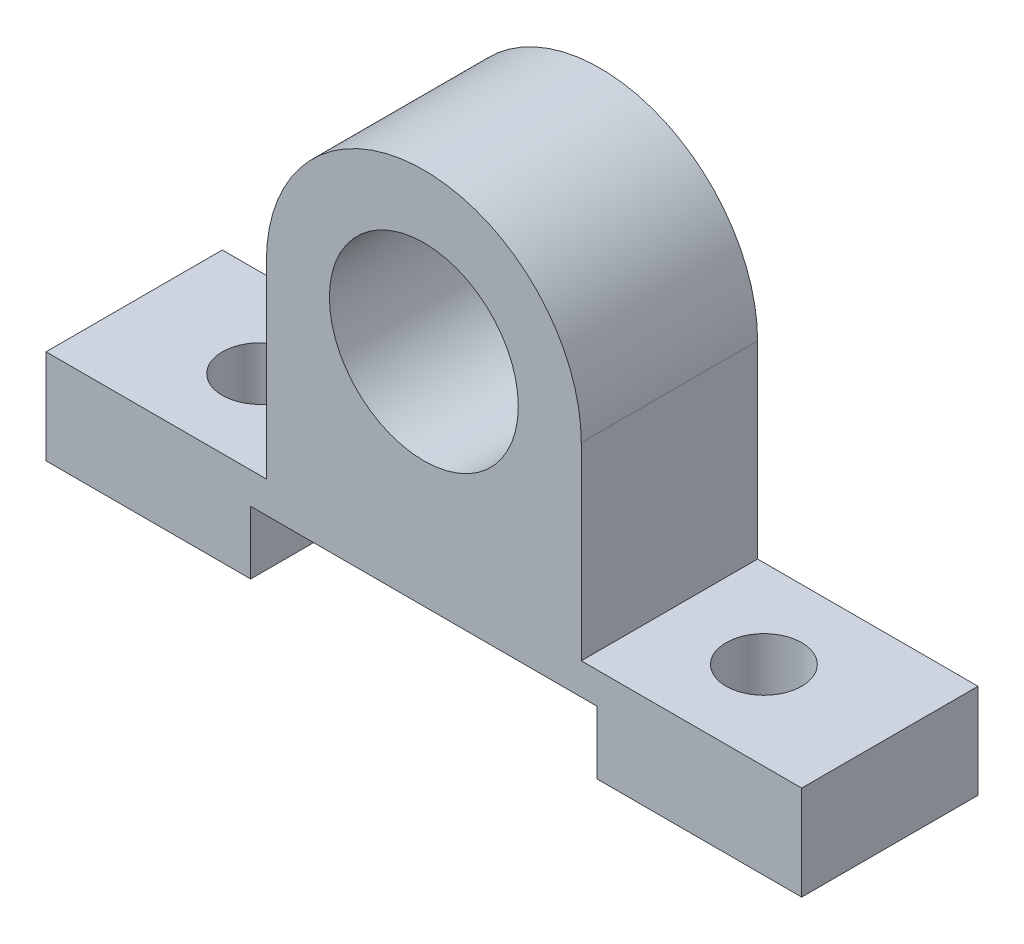
ISO-10303-21;
HEADER;
FILE_DESCRIPTION(('STEP AP214'),'2;1');
FILE_NAME('part.step','',(''),(''),'','','');
FILE_SCHEMA(('AUTOMOTIVE_DESIGN { 1 0 10303 214 1 1 1 1 }'));
ENDSEC;
DATA;
#1=APPLICATION_CONTEXT('core data for automotive mechanical design processes');
#2=APPLICATION_PROTOCOL_DEFINITION('international standard','automotive_design',2000,#1);
#3=PRODUCT_CONTEXT('',#1,'mechanical');
#4=PRODUCT('Part','Part','',(#3));
#5=PRODUCT_RELATED_PRODUCT_CATEGORY('part','',(#4));
#6=PRODUCT_DEFINITION_FORMATION('','',#4);
#7=PRODUCT_DEFINITION_CONTEXT('part definition',#1,'design');
#8=PRODUCT_DEFINITION('design','',#6,#7);
#9=PRODUCT_DEFINITION_SHAPE('','',#8);
#10=(LENGTH_UNIT() NAMED_UNIT(*) SI_UNIT(.MILLI.,.METRE.));
#11=(NAMED_UNIT(*) PLANE_ANGLE_UNIT() SI_UNIT($,.RADIAN.));
#12=(NAMED_UNIT(*) SI_UNIT($,.STERADIAN.) SOLID_ANGLE_UNIT());
#13=UNCERTAINTY_MEASURE_WITH_UNIT(LENGTH_MEASURE(1.E-05),#10,'distance_accuracy_value','');
#14=(GEOMETRIC_REPRESENTATION_CONTEXT(3) GLOBAL_UNCERTAINTY_ASSIGNED_CONTEXT((#13)) GLOBAL_UNIT_ASSIGNED_CONTEXT((#10,
#11,#12)) REPRESENTATION_CONTEXT('',''));
#15=CARTESIAN_POINT('',(0.,0.,0.));
#16=DIRECTION('',(0.,0.,1.));
#17=DIRECTION('',(1.,0.,0.));
#18=AXIS2_PLACEMENT_3D('',#15,#16,#17);
#19=CARTESIAN_POINT('',(0.,57.15,17.78));
#20=DIRECTION('',(0.,0.,1.));
#21=DIRECTION('',(1.,0.,0.));
#22=AXIS2_PLACEMENT_3D('',#19,#20,#21);
#23=PLANE('',#22);
#24=DIRECTION('',(0.,-1.,0.));
#25=VECTOR('',#24,1.);
#26=CARTESIAN_POINT('',(34.925,0.,17.78));
#27=LINE('',#26,#25);
#28=CARTESIAN_POINT('',(34.925,12.7,17.78));
#29=VERTEX_POINT('',#28);
#30=CARTESIAN_POINT('',(34.925,0.,17.78));
#31=VERTEX_POINT('',#30);
#32=EDGE_CURVE('E204',#29,#31,#27,.T.);
#33=ORIENTED_EDGE('',*,*,#32,.T.);
#34=DIRECTION('',(1.,0.,0.));
#35=VECTOR('',#34,1.);
#36=CARTESIAN_POINT('',(34.925,0.,17.78));
#37=LINE('',#36,#35);
#38=CARTESIAN_POINT('',(76.2,0.,17.78));
#39=VERTEX_POINT('',#38);
#40=EDGE_CURVE('E116',#31,#39,#37,.T.);
#41=ORIENTED_EDGE('',*,*,#40,.T.);
#42=DIRECTION('',(0.,1.,0.));
#43=VECTOR('',#42,1.);
#44=CARTESIAN_POINT('',(76.2,0.,17.78));
#45=LINE('',#44,#43);
#46=CARTESIAN_POINT('',(76.2,19.05,17.78));
#47=VERTEX_POINT('',#46);
#48=EDGE_CURVE('E241',#39,#47,#45,.T.);
#49=ORIENTED_EDGE('',*,*,#48,.T.);
#50=DIRECTION('',(-1.,0.,0.));
#51=VECTOR('',#50,1.);
#52=CARTESIAN_POINT('',(76.2,19.05,17.78));
#53=LINE('',#52,#51);
#54=CARTESIAN_POINT('',(31.75,19.05,17.78));
#55=VERTEX_POINT('',#54);
#56=EDGE_CURVE('E261',#47,#55,#53,.T.);
#57=ORIENTED_EDGE('',*,*,#56,.T.);
#58=DIRECTION('',(0.,1.,0.));
#59=VECTOR('',#58,1.);
#60=CARTESIAN_POINT('',(31.75,19.05,17.78));
#61=LINE('',#60,#59);
#62=CARTESIAN_POINT('',(31.75,57.15,17.78));
#63=VERTEX_POINT('',#62);
#64=EDGE_CURVE('E257',#55,#63,#61,.T.);
#65=ORIENTED_EDGE('',*,*,#64,.T.);
#66=CARTESIAN_POINT('',(0.,57.15,17.78));
#67=DIRECTION('',(0.,0.,1.));
#68=DIRECTION('',(1.,0.,0.));
#69=AXIS2_PLACEMENT_3D('',#66,#67,#68);
#70=CIRCLE('',#69,31.75);
#71=CARTESIAN_POINT('',(-31.75,57.15,17.78));
#72=VERTEX_POINT('',#71);
#73=EDGE_CURVE('E260',#63,#72,#70,.T.);
#74=ORIENTED_EDGE('',*,*,#73,.T.);
#75=DIRECTION('',(0.,-1.,0.));
#76=VECTOR('',#75,1.);
#77=CARTESIAN_POINT('',(-31.75,19.05,17.78));
#78=LINE('',#77,#76);
#79=CARTESIAN_POINT('',(-31.75,19.05,17.78));
#80=VERTEX_POINT('',#79);
#81=EDGE_CURVE('E265',#72,#80,#78,.T.);
#82=ORIENTED_EDGE('',*,*,#81,.T.);
#83=DIRECTION('',(-1.,0.,0.));
#84=VECTOR('',#83,1.);
#85=CARTESIAN_POINT('',(-76.2,19.05,17.78));
#86=LINE('',#85,#84);
#87=CARTESIAN_POINT('',(-76.2,19.05,17.78));
#88=VERTEX_POINT('',#87);
#89=EDGE_CURVE('E272',#80,#88,#86,.T.);
#90=ORIENTED_EDGE('',*,*,#89,.T.);
#91=DIRECTION('',(0.,-1.,0.));
#92=VECTOR('',#91,1.);
#93=CARTESIAN_POINT('',(-76.2,0.,17.78));
#94=LINE('',#93,#92);
#95=CARTESIAN_POINT('',(-76.2,0.,17.78));
#96=VERTEX_POINT('',#95);
#97=EDGE_CURVE('E147',#88,#96,#94,.T.);
#98=ORIENTED_EDGE('',*,*,#97,.T.);
#99=DIRECTION('',(1.,0.,0.));
#100=VECTOR('',#99,1.);
#101=CARTESIAN_POINT('',(-34.925,0.,17.78));
#102=LINE('',#101,#100);
#103=CARTESIAN_POINT('',(-34.925,0.,17.78));
#104=VERTEX_POINT('',#103);
#105=EDGE_CURVE('E141',#96,#104,#102,.T.);
#106=ORIENTED_EDGE('',*,*,#105,.T.);
#107=DIRECTION('',(0.,1.,0.));
#108=VECTOR('',#107,1.);
#109=CARTESIAN_POINT('',(-34.925,0.,17.78));
#110=LINE('',#109,#108);
#111=CARTESIAN_POINT('',(-34.925,12.7,17.78));
#112=VERTEX_POINT('',#111);
#113=EDGE_CURVE('E145',#104,#112,#110,.T.);
#114=ORIENTED_EDGE('',*,*,#113,.T.);
#115=DIRECTION('',(1.,0.,0.));
#116=VECTOR('',#115,1.);
#117=CARTESIAN_POINT('',(34.925,12.7,17.78));
#118=LINE('',#117,#116);
#119=EDGE_CURVE('E61',#112,#29,#118,.T.);
#120=ORIENTED_EDGE('',*,*,#119,.T.);
#121=EDGE_LOOP('',(#33,#41,#49,#57,#65,#74,#82,#90,#98,#106,#114,#120));
#122=FACE_BOUND('',#121,.T.);
#123=CARTESIAN_POINT('',(0.,57.15,17.78));
#124=DIRECTION('',(0.,0.,1.));
#125=DIRECTION('',(1.,0.,0.));
#126=AXIS2_PLACEMENT_3D('',#123,#124,#125);
#127=CIRCLE('',#126,19.05);
#128=CARTESIAN_POINT('',(-19.05,57.15,17.78));
#129=VERTEX_POINT('',#128);
#130=EDGE_CURVE('E174',#129,#129,#127,.T.);
#131=ORIENTED_EDGE('',*,*,#130,.F.);
#132=EDGE_LOOP('',(#131));
#133=FACE_BOUND('',#132,.T.);
#134=ADVANCED_FACE('F43',(#122,#133),#23,.T.);
#135=CARTESIAN_POINT('',(0.,57.15,-17.78));
#136=DIRECTION('',(0.,0.,1.));
#137=DIRECTION('',(1.,0.,0.));
#138=AXIS2_PLACEMENT_3D('',#135,#136,#137);
#139=PLANE('',#138);
#140=DIRECTION('',(0.,-1.,0.));
#141=VECTOR('',#140,1.);
#142=CARTESIAN_POINT('',(34.925,0.,-17.78));
#143=LINE('',#142,#141);
#144=CARTESIAN_POINT('',(34.925,12.7,-17.78));
#145=VERTEX_POINT('',#144);
#146=CARTESIAN_POINT('',(34.925,0.,-17.78));
#147=VERTEX_POINT('',#146);
#148=EDGE_CURVE('E169',#145,#147,#143,.T.);
#149=ORIENTED_EDGE('',*,*,#148,.F.);
#150=DIRECTION('',(1.,0.,0.));
#151=VECTOR('',#150,1.);
#152=CARTESIAN_POINT('',(34.925,12.7,-17.78));
#153=LINE('',#152,#151);
#154=CARTESIAN_POINT('',(-34.925,12.7,-17.78));
#155=VERTEX_POINT('',#154);
#156=EDGE_CURVE('E108',#155,#145,#153,.T.);
#157=ORIENTED_EDGE('',*,*,#156,.F.);
#158=DIRECTION('',(0.,1.,0.));
#159=VECTOR('',#158,1.);
#160=CARTESIAN_POINT('',(-34.925,0.,-17.78));
#161=LINE('',#160,#159);
#162=CARTESIAN_POINT('',(-34.925,0.,-17.78));
#163=VERTEX_POINT('',#162);
#164=EDGE_CURVE('E102',#163,#155,#161,.T.);
#165=ORIENTED_EDGE('',*,*,#164,.F.);
#166=DIRECTION('',(1.,0.,0.));
#167=VECTOR('',#166,1.);
#168=CARTESIAN_POINT('',(-34.925,0.,-17.78));
#169=LINE('',#168,#167);
#170=CARTESIAN_POINT('',(-76.2,0.,-17.78));
#171=VERTEX_POINT('',#170);
#172=EDGE_CURVE('E156',#171,#163,#169,.T.);
#173=ORIENTED_EDGE('',*,*,#172,.F.);
#174=DIRECTION('',(0.,-1.,0.));
#175=VECTOR('',#174,1.);
#176=CARTESIAN_POINT('',(-76.2,0.,-17.78));
#177=LINE('',#176,#175);
#178=CARTESIAN_POINT('',(-76.2,19.05,-17.78));
#179=VERTEX_POINT('',#178);
#180=EDGE_CURVE('E195',#179,#171,#177,.T.);
#181=ORIENTED_EDGE('',*,*,#180,.F.);
#182=DIRECTION('',(-1.,0.,0.));
#183=VECTOR('',#182,1.);
#184=CARTESIAN_POINT('',(-76.2,19.05,-17.78));
#185=LINE('',#184,#183);
#186=CARTESIAN_POINT('',(-31.75,19.05,-17.78));
#187=VERTEX_POINT('',#186);
#188=EDGE_CURVE('E192',#187,#179,#185,.T.);
#189=ORIENTED_EDGE('',*,*,#188,.F.);
#190=DIRECTION('',(0.,-1.,0.));
#191=VECTOR('',#190,1.);
#192=CARTESIAN_POINT('',(-31.75,19.05,-17.78));
#193=LINE('',#192,#191);
#194=CARTESIAN_POINT('',(-31.75,57.15,-17.78));
#195=VERTEX_POINT('',#194);
#196=EDGE_CURVE('E189',#195,#187,#193,.T.);
#197=ORIENTED_EDGE('',*,*,#196,.F.);
#198=CARTESIAN_POINT('',(0.,57.15,-17.78));
#199=DIRECTION('',(0.,0.,1.));
#200=DIRECTION('',(1.,0.,0.));
#201=AXIS2_PLACEMENT_3D('',#198,#199,#200);
#202=CIRCLE('',#201,31.75);
#203=CARTESIAN_POINT('',(31.75,57.15,-17.78));
#204=VERTEX_POINT('',#203);
#205=EDGE_CURVE('E186',#204,#195,#202,.T.);
#206=ORIENTED_EDGE('',*,*,#205,.F.);
#207=DIRECTION('',(0.,1.,0.));
#208=VECTOR('',#207,1.);
#209=CARTESIAN_POINT('',(31.75,19.05,-17.78));
#210=LINE('',#209,#208);
#211=CARTESIAN_POINT('',(31.75,19.05,-17.78));
#212=VERTEX_POINT('',#211);
#213=EDGE_CURVE('E183',#212,#204,#210,.T.);
#214=ORIENTED_EDGE('',*,*,#213,.F.);
#215=DIRECTION('',(-1.,0.,0.));
#216=VECTOR('',#215,1.);
#217=CARTESIAN_POINT('',(76.2,19.05,-17.78));
#218=LINE('',#217,#216);
#219=CARTESIAN_POINT('',(76.2,19.05,-17.78));
#220=VERTEX_POINT('',#219);
#221=EDGE_CURVE('E180',#220,#212,#218,.T.);
#222=ORIENTED_EDGE('',*,*,#221,.F.);
#223=DIRECTION('',(0.,1.,0.));
#224=VECTOR('',#223,1.);
#225=CARTESIAN_POINT('',(76.2,0.,-17.78));
#226=LINE('',#225,#224);
#227=CARTESIAN_POINT('',(76.2,0.,-17.78));
#228=VERTEX_POINT('',#227);
#229=EDGE_CURVE('E177',#228,#220,#226,.T.);
#230=ORIENTED_EDGE('',*,*,#229,.F.);
#231=DIRECTION('',(1.,0.,0.));
#232=VECTOR('',#231,1.);
#233=CARTESIAN_POINT('',(34.925,0.,-17.78));
#234=LINE('',#233,#232);
#235=EDGE_CURVE('E173',#147,#228,#234,.T.);
#236=ORIENTED_EDGE('',*,*,#235,.F.);
#237=EDGE_LOOP('',(#149,#157,#165,#173,#181,#189,#197,#206,#214,#222,#230,#236));
#238=FACE_BOUND('',#237,.T.);
#239=CARTESIAN_POINT('',(0.,57.15,-17.78));
#240=DIRECTION('',(0.,0.,1.));
#241=DIRECTION('',(1.,0.,0.));
#242=AXIS2_PLACEMENT_3D('',#239,#240,#241);
#243=CIRCLE('',#242,19.05);
#244=CARTESIAN_POINT('',(-19.05,57.15,-17.78));
#245=VERTEX_POINT('',#244);
#246=EDGE_CURVE('E328',#245,#245,#243,.T.);
#247=ORIENTED_EDGE('',*,*,#246,.T.);
#248=EDGE_LOOP('',(#247));
#249=FACE_BOUND('',#248,.T.);
#250=ADVANCED_FACE('F245',(#238,#249),#139,.F.);
#251=CARTESIAN_POINT('',(34.925,0.,17.78));
#252=DIRECTION('',(1.,0.,0.));
#253=DIRECTION('',(0.,0.,-1.));
#254=AXIS2_PLACEMENT_3D('',#251,#252,#253);
#255=PLANE('',#254);
#256=ORIENTED_EDGE('',*,*,#148,.T.);
#257=DIRECTION('',(0.,0.,-1.));
#258=VECTOR('',#257,1.);
#259=CARTESIAN_POINT('',(34.925,0.,17.78));
#260=LINE('',#259,#258);
#261=EDGE_CURVE('E11',#31,#147,#260,.T.);
#262=ORIENTED_EDGE('',*,*,#261,.F.);
#263=ORIENTED_EDGE('',*,*,#32,.F.);
#264=DIRECTION('',(0.,0.,-1.));
#265=VECTOR('',#264,1.);
#266=CARTESIAN_POINT('',(34.925,12.7,17.78));
#267=LINE('',#266,#265);
#268=EDGE_CURVE('E165',#29,#145,#267,.T.);
#269=ORIENTED_EDGE('',*,*,#268,.T.);
#270=EDGE_LOOP('',(#256,#262,#263,#269));
#271=FACE_BOUND('',#270,.T.);
#272=ADVANCED_FACE('F45',(#271),#255,.F.);
#273=CARTESIAN_POINT('',(34.925,0.,17.78));
#274=DIRECTION('',(0.,1.,0.));
#275=DIRECTION('',(0.,0.,1.));
#276=AXIS2_PLACEMENT_3D('',#273,#274,#275);
#277=PLANE('',#276);
#278=CARTESIAN_POINT('',(50.8,0.,0.));
#279=DIRECTION('',(0.,1.,0.));
#280=DIRECTION('',(-1.,0.,0.));
#281=AXIS2_PLACEMENT_3D('',#278,#279,#280);
#282=CIRCLE('',#281,7.62);
#283=CARTESIAN_POINT('',(43.18,0.,0.));
#284=VERTEX_POINT('',#283);
#285=EDGE_CURVE('E331',#284,#284,#282,.T.);
#286=ORIENTED_EDGE('',*,*,#285,.T.);
#287=EDGE_LOOP('',(#286));
#288=FACE_BOUND('',#287,.T.);
#289=ORIENTED_EDGE('',*,*,#235,.T.);
#290=DIRECTION('',(0.,0.,-1.));
#291=VECTOR('',#290,1.);
#292=CARTESIAN_POINT('',(76.2,0.,17.78));
#293=LINE('',#292,#291);
#294=EDGE_CURVE('E53',#39,#228,#293,.T.);
#295=ORIENTED_EDGE('',*,*,#294,.F.);
#296=ORIENTED_EDGE('',*,*,#40,.F.);
#297=ORIENTED_EDGE('',*,*,#261,.T.);
#298=EDGE_LOOP('',(#289,#295,#296,#297));
#299=FACE_BOUND('',#298,.T.);
#300=ADVANCED_FACE('F352',(#288,#299),#277,.F.);
#301=CARTESIAN_POINT('',(76.2,0.,17.78));
#302=DIRECTION('',(-1.,0.,0.));
#303=DIRECTION('',(0.,0.,1.));
#304=AXIS2_PLACEMENT_3D('',#301,#302,#303);
#305=PLANE('',#304);
#306=ORIENTED_EDGE('',*,*,#229,.T.);
#307=DIRECTION('',(0.,0.,-1.));
#308=VECTOR('',#307,1.);
#309=CARTESIAN_POINT('',(76.2,19.05,17.78));
#310=LINE('',#309,#308);
#311=EDGE_CURVE('E231',#47,#220,#310,.T.);
#312=ORIENTED_EDGE('',*,*,#311,.F.);
#313=ORIENTED_EDGE('',*,*,#48,.F.);
#314=ORIENTED_EDGE('',*,*,#294,.T.);
#315=EDGE_LOOP('',(#306,#312,#313,#314));
#316=FACE_BOUND('',#315,.T.);
#317=ADVANCED_FACE('F239',(#316),#305,.F.);
#318=CARTESIAN_POINT('',(76.2,19.05,17.78));
#319=DIRECTION('',(0.,-1.,0.));
#320=DIRECTION('',(1.,0.,0.));
#321=AXIS2_PLACEMENT_3D('',#318,#319,#320);
#322=PLANE('',#321);
#323=CARTESIAN_POINT('',(50.8,19.05,0.));
#324=DIRECTION('',(0.,1.,0.));
#325=DIRECTION('',(-1.,0.,0.));
#326=AXIS2_PLACEMENT_3D('',#323,#324,#325);
#327=CIRCLE('',#326,7.62);
#328=CARTESIAN_POINT('',(43.18,19.05,0.));
#329=VERTEX_POINT('',#328);
#330=EDGE_CURVE('E324',#329,#329,#327,.T.);
#331=ORIENTED_EDGE('',*,*,#330,.F.);
#332=EDGE_LOOP('',(#331));
#333=FACE_BOUND('',#332,.T.);
#334=ORIENTED_EDGE('',*,*,#221,.T.);
#335=DIRECTION('',(0.,0.,-1.));
#336=VECTOR('',#335,1.);
#337=CARTESIAN_POINT('',(31.75,19.05,17.78));
#338=LINE('',#337,#336);
#339=EDGE_CURVE('E227',#55,#212,#338,.T.);
#340=ORIENTED_EDGE('',*,*,#339,.F.);
#341=ORIENTED_EDGE('',*,*,#56,.F.);
#342=ORIENTED_EDGE('',*,*,#311,.T.);
#343=EDGE_LOOP('',(#334,#340,#341,#342));
#344=FACE_BOUND('',#343,.T.);
#345=ADVANCED_FACE('F251',(#333,#344),#322,.F.);
#346=CARTESIAN_POINT('',(31.75,19.05,17.78));
#347=DIRECTION('',(-1.,0.,0.));
#348=DIRECTION('',(0.,0.,1.));
#349=AXIS2_PLACEMENT_3D('',#346,#347,#348);
#350=PLANE('',#349);
#351=ORIENTED_EDGE('',*,*,#213,.T.);
#352=DIRECTION('',(0.,0.,-1.));
#353=VECTOR('',#352,1.);
#354=CARTESIAN_POINT('',(31.75,57.15,17.78));
#355=LINE('',#354,#353);
#356=EDGE_CURVE('E223',#63,#204,#355,.T.);
#357=ORIENTED_EDGE('',*,*,#356,.F.);
#358=ORIENTED_EDGE('',*,*,#64,.F.);
#359=ORIENTED_EDGE('',*,*,#339,.T.);
#360=EDGE_LOOP('',(#351,#357,#358,#359));
#361=FACE_BOUND('',#360,.T.);
#362=ADVANCED_FACE('F255',(#361),#350,.F.);
#363=CARTESIAN_POINT('',(0.,57.15,17.78));
#364=DIRECTION('',(0.,0.,-1.));
#365=DIRECTION('',(-1.,0.,0.));
#366=AXIS2_PLACEMENT_3D('',#363,#364,#365);
#367=CYLINDRICAL_SURFACE('',#366,31.75);
#368=ORIENTED_EDGE('',*,*,#205,.T.);
#369=DIRECTION('',(0.,0.,-1.));
#370=VECTOR('',#369,1.);
#371=CARTESIAN_POINT('',(-31.75,57.15,17.78));
#372=LINE('',#371,#370);
#373=EDGE_CURVE('E219',#72,#195,#372,.T.);
#374=ORIENTED_EDGE('',*,*,#373,.F.);
#375=ORIENTED_EDGE('',*,*,#73,.F.);
#376=ORIENTED_EDGE('',*,*,#356,.T.);
#377=EDGE_LOOP('',(#368,#374,#375,#376));
#378=FACE_BOUND('',#377,.T.);
#379=ADVANCED_FACE('F362',(#378),#367,.T.);
#380=CARTESIAN_POINT('',(-31.75,19.05,17.78));
#381=DIRECTION('',(1.,0.,0.));
#382=DIRECTION('',(0.,0.,-1.));
#383=AXIS2_PLACEMENT_3D('',#380,#381,#382);
#384=PLANE('',#383);
#385=ORIENTED_EDGE('',*,*,#196,.T.);
#386=DIRECTION('',(0.,0.,-1.));
#387=VECTOR('',#386,1.);
#388=CARTESIAN_POINT('',(-31.75,19.05,17.78));
#389=LINE('',#388,#387);
#390=EDGE_CURVE('E215',#80,#187,#389,.T.);
#391=ORIENTED_EDGE('',*,*,#390,.F.);
#392=ORIENTED_EDGE('',*,*,#81,.F.);
#393=ORIENTED_EDGE('',*,*,#373,.T.);
#394=EDGE_LOOP('',(#385,#391,#392,#393));
#395=FACE_BOUND('',#394,.T.);
#396=ADVANCED_FACE('F419',(#395),#384,.F.);
#397=CARTESIAN_POINT('',(-76.2,19.05,17.78));
#398=DIRECTION('',(0.,-1.,0.));
#399=DIRECTION('',(1.,0.,0.));
#400=AXIS2_PLACEMENT_3D('',#397,#398,#399);
#401=PLANE('',#400);
#402=CARTESIAN_POINT('',(-50.8,19.05,0.));
#403=DIRECTION('',(0.,1.,0.));
#404=DIRECTION('',(-1.,0.,0.));
#405=AXIS2_PLACEMENT_3D('',#402,#403,#404);
#406=CIRCLE('',#405,7.62);
#407=CARTESIAN_POINT('',(-58.42,19.05,0.));
#408=VERTEX_POINT('',#407);
#409=EDGE_CURVE('E321',#408,#408,#406,.T.);
#410=ORIENTED_EDGE('',*,*,#409,.F.);
#411=EDGE_LOOP('',(#410));
#412=FACE_BOUND('',#411,.T.);
#413=ORIENTED_EDGE('',*,*,#188,.T.);
#414=DIRECTION('',(0.,0.,-1.));
#415=VECTOR('',#414,1.);
#416=CARTESIAN_POINT('',(-76.2,19.05,17.78));
#417=LINE('',#416,#415);
#418=EDGE_CURVE('E211',#88,#179,#417,.T.);
#419=ORIENTED_EDGE('',*,*,#418,.F.);
#420=ORIENTED_EDGE('',*,*,#89,.F.);
#421=ORIENTED_EDGE('',*,*,#390,.T.);
#422=EDGE_LOOP('',(#413,#419,#420,#421));
#423=FACE_BOUND('',#422,.T.);
#424=ADVANCED_FACE('F280',(#412,#423),#401,.F.);
#425=CARTESIAN_POINT('',(-76.2,0.,17.78));
#426=DIRECTION('',(1.,0.,0.));
#427=DIRECTION('',(0.,0.,-1.));
#428=AXIS2_PLACEMENT_3D('',#425,#426,#427);
#429=PLANE('',#428);
#430=ORIENTED_EDGE('',*,*,#180,.T.);
#431=DIRECTION('',(0.,0.,-1.));
#432=VECTOR('',#431,1.);
#433=CARTESIAN_POINT('',(-76.2,0.,17.78));
#434=LINE('',#433,#432);
#435=EDGE_CURVE('E158',#96,#171,#434,.T.);
#436=ORIENTED_EDGE('',*,*,#435,.F.);
#437=ORIENTED_EDGE('',*,*,#97,.F.);
#438=ORIENTED_EDGE('',*,*,#418,.T.);
#439=EDGE_LOOP('',(#430,#436,#437,#438));
#440=FACE_BOUND('',#439,.T.);
#441=ADVANCED_FACE('F284',(#440),#429,.F.);
#442=CARTESIAN_POINT('',(-34.925,0.,17.78));
#443=DIRECTION('',(0.,1.,0.));
#444=DIRECTION('',(0.,0.,1.));
#445=AXIS2_PLACEMENT_3D('',#442,#443,#444);
#446=PLANE('',#445);
#447=CARTESIAN_POINT('',(-50.8,0.,0.));
#448=DIRECTION('',(0.,1.,0.));
#449=DIRECTION('',(-1.,0.,0.));
#450=AXIS2_PLACEMENT_3D('',#447,#448,#449);
#451=CIRCLE('',#450,7.62);
#452=CARTESIAN_POINT('',(-58.42,0.,0.));
#453=VERTEX_POINT('',#452);
#454=EDGE_CURVE('E318',#453,#453,#451,.T.);
#455=ORIENTED_EDGE('',*,*,#454,.T.);
#456=EDGE_LOOP('',(#455));
#457=FACE_BOUND('',#456,.T.);
#458=ORIENTED_EDGE('',*,*,#172,.T.);
#459=DIRECTION('',(0.,0.,-1.));
#460=VECTOR('',#459,1.);
#461=CARTESIAN_POINT('',(-34.925,0.,17.78));
#462=LINE('',#461,#460);
#463=EDGE_CURVE('E153',#104,#163,#462,.T.);
#464=ORIENTED_EDGE('',*,*,#463,.F.);
#465=ORIENTED_EDGE('',*,*,#105,.F.);
#466=ORIENTED_EDGE('',*,*,#435,.T.);
#467=EDGE_LOOP('',(#458,#464,#465,#466));
#468=FACE_BOUND('',#467,.T.);
#469=ADVANCED_FACE('F154',(#457,#468),#446,.F.);
#470=CARTESIAN_POINT('',(-34.925,0.,17.78));
#471=DIRECTION('',(-1.,0.,0.));
#472=DIRECTION('',(0.,0.,1.));
#473=AXIS2_PLACEMENT_3D('',#470,#471,#472);
#474=PLANE('',#473);
#475=ORIENTED_EDGE('',*,*,#164,.T.);
#476=DIRECTION('',(0.,0.,-1.));
#477=VECTOR('',#476,1.);
#478=CARTESIAN_POINT('',(-34.925,12.7,17.78));
#479=LINE('',#478,#477);
#480=EDGE_CURVE('E159',#112,#155,#479,.T.);
#481=ORIENTED_EDGE('',*,*,#480,.F.);
#482=ORIENTED_EDGE('',*,*,#113,.F.);
#483=ORIENTED_EDGE('',*,*,#463,.T.);
#484=EDGE_LOOP('',(#475,#481,#482,#483));
#485=FACE_BOUND('',#484,.T.);
#486=ADVANCED_FACE('F161',(#485),#474,.F.);
#487=CARTESIAN_POINT('',(34.925,12.7,17.78));
#488=DIRECTION('',(0.,1.,0.));
#489=DIRECTION('',(0.,0.,1.));
#490=AXIS2_PLACEMENT_3D('',#487,#488,#489);
#491=PLANE('',#490);
#492=ORIENTED_EDGE('',*,*,#156,.T.);
#493=ORIENTED_EDGE('',*,*,#268,.F.);
#494=ORIENTED_EDGE('',*,*,#119,.F.);
#495=ORIENTED_EDGE('',*,*,#480,.T.);
#496=EDGE_LOOP('',(#492,#493,#494,#495));
#497=FACE_BOUND('',#496,.T.);
#498=ADVANCED_FACE('F288',(#497),#491,.F.);
#499=CARTESIAN_POINT('',(0.,57.15,17.78));
#500=DIRECTION('',(0.,0.,-1.));
#501=DIRECTION('',(-1.,0.,0.));
#502=AXIS2_PLACEMENT_3D('',#499,#500,#501);
#503=CYLINDRICAL_SURFACE('',#502,19.05);
#504=CARTESIAN_POINT('',(-19.05,57.15,17.78));
#505=CARTESIAN_POINT('',(-19.05,57.15,17.4095833333333));
#506=CARTESIAN_POINT('',(-19.05,57.15,17.0391666666667));
#507=CARTESIAN_POINT('',(-19.05,57.15,16.2983333333333));
#508=CARTESIAN_POINT('',(-19.05,57.15,15.9279166666667));
#509=CARTESIAN_POINT('',(-19.05,57.15,15.1870833333333));
#510=CARTESIAN_POINT('',(-19.05,57.15,14.8166666666667));
#511=CARTESIAN_POINT('',(-19.05,57.15,14.0758333333333));
#512=CARTESIAN_POINT('',(-19.05,57.15,13.7054166666667));
#513=CARTESIAN_POINT('',(-19.05,57.15,12.9645833333333));
#514=CARTESIAN_POINT('',(-19.05,57.15,12.5941666666667));
#515=CARTESIAN_POINT('',(-19.05,57.15,11.8533333333333));
#516=CARTESIAN_POINT('',(-19.05,57.15,11.4829166666667));
#517=CARTESIAN_POINT('',(-19.05,57.15,10.7420833333333));
#518=CARTESIAN_POINT('',(-19.05,57.15,10.3716666666667));
#519=CARTESIAN_POINT('',(-19.05,57.15,9.63083333333333));
#520=CARTESIAN_POINT('',(-19.05,57.15,9.26041666666666));
#521=CARTESIAN_POINT('',(-19.05,57.15,8.51958333333333));
#522=CARTESIAN_POINT('',(-19.05,57.15,8.14916666666666));
#523=CARTESIAN_POINT('',(-19.05,57.15,7.40833333333333));
#524=CARTESIAN_POINT('',(-19.05,57.15,7.03791666666666));
#525=CARTESIAN_POINT('',(-19.05,57.15,6.29708333333333));
#526=CARTESIAN_POINT('',(-19.05,57.15,5.92666666666666));
#527=CARTESIAN_POINT('',(-19.05,57.15,5.18583333333333));
#528=CARTESIAN_POINT('',(-19.05,57.15,4.81541666666666));
#529=CARTESIAN_POINT('',(-19.05,57.15,4.07458333333333));
#530=CARTESIAN_POINT('',(-19.05,57.15,3.70416666666666));
#531=CARTESIAN_POINT('',(-19.05,57.15,2.96333333333333));
#532=CARTESIAN_POINT('',(-19.05,57.15,2.59291666666666));
#533=CARTESIAN_POINT('',(-19.05,57.15,1.85208333333333));
#534=CARTESIAN_POINT('',(-19.05,57.15,1.48166666666666));
#535=CARTESIAN_POINT('',(-19.05,57.15,0.740833333333331));
#536=CARTESIAN_POINT('',(-19.05,57.15,0.370416666666664));
#537=CARTESIAN_POINT('',(-19.05,57.15,-0.370416666666671));
#538=CARTESIAN_POINT('',(-19.05,57.15,-0.740833333333338));
#539=CARTESIAN_POINT('',(-19.05,57.15,-1.48166666666667));
#540=CARTESIAN_POINT('',(-19.05,57.15,-1.85208333333334));
#541=CARTESIAN_POINT('',(-19.05,57.15,-2.59291666666667));
#542=CARTESIAN_POINT('',(-19.05,57.15,-2.96333333333334));
#543=CARTESIAN_POINT('',(-19.05,57.15,-3.70416666666667));
#544=CARTESIAN_POINT('',(-19.05,57.15,-4.07458333333334));
#545=CARTESIAN_POINT('',(-19.05,57.15,-4.81541666666667));
#546=CARTESIAN_POINT('',(-19.05,57.15,-5.18583333333334));
#547=CARTESIAN_POINT('',(-19.05,57.15,-5.92666666666667));
#548=CARTESIAN_POINT('',(-19.05,57.15,-6.29708333333334));
#549=CARTESIAN_POINT('',(-19.05,57.15,-7.03791666666667));
#550=CARTESIAN_POINT('',(-19.05,57.15,-7.40833333333334));
#551=CARTESIAN_POINT('',(-19.05,57.15,-8.14916666666667));
#552=CARTESIAN_POINT('',(-19.05,57.15,-8.51958333333334));
#553=CARTESIAN_POINT('',(-19.05,57.15,-9.26041666666667));
#554=CARTESIAN_POINT('',(-19.05,57.15,-9.63083333333334));
#555=CARTESIAN_POINT('',(-19.05,57.15,-10.3716666666667));
#556=CARTESIAN_POINT('',(-19.05,57.15,-10.7420833333333));
#557=CARTESIAN_POINT('',(-19.05,57.15,-11.4829166666667));
#558=CARTESIAN_POINT('',(-19.05,57.15,-11.8533333333333));
#559=CARTESIAN_POINT('',(-19.05,57.15,-12.5941666666667));
#560=CARTESIAN_POINT('',(-19.05,57.15,-12.9645833333333));
#561=CARTESIAN_POINT('',(-19.05,57.15,-13.7054166666667));
#562=CARTESIAN_POINT('',(-19.05,57.15,-14.0758333333333));
#563=CARTESIAN_POINT('',(-19.05,57.15,-14.8166666666667));
#564=CARTESIAN_POINT('',(-19.05,57.15,-15.1870833333333));
#565=CARTESIAN_POINT('',(-19.05,57.15,-15.9279166666667));
#566=CARTESIAN_POINT('',(-19.05,57.15,-16.2983333333333));
#567=CARTESIAN_POINT('',(-19.05,57.15,-17.0391666666667));
#568=CARTESIAN_POINT('',(-19.05,57.15,-17.4095833333333));
#569=CARTESIAN_POINT('',(-19.05,57.15,-17.78));
#570=B_SPLINE_CURVE_WITH_KNOTS('',3,(#504,#505,#506,#507,#508,#509,#510,#511,#512,#513,#514,
#515,#516,#517,#518,#519,#520,#521,#522,#523,#524,#525,#526,#527,#528,#529,#530,#531,#532,#533,
#534,#535,#536,#537,#538,#539,#540,#541,#542,#543,#544,#545,#546,#547,#548,#549,#550,#551,#552,
#553,#554,#555,#556,#557,#558,#559,#560,#561,#562,#563,#564,#565,#566,#567,#568,#569),
.UNSPECIFIED.,.F.,.F.,(4,2,2,2,2,2,2,2,2,2,2,2,2,2,2,2,2,2,2,2,2,2,2,2,2,2,2,2,2,2,2,2,4),(0.,
1.11125,2.2225,3.33375,4.445,5.55625,6.6675,7.77875,8.89,10.00125,11.1125,12.22375,13.335,
14.44625,15.5575,16.66875,17.78,18.89125,20.0025,21.11375,22.225,23.33625,24.4475,25.55875,
26.67,27.78125,28.8925,30.00375,31.115,32.22625,33.3375,34.44875,35.56),.UNSPECIFIED.);
#571=EDGE_CURVE('BSEAM290',#129,#245,#570,.T.);
#572=ORIENTED_EDGE('',*,*,#130,.T.);
#573=ORIENTED_EDGE('',*,*,#246,.F.);
#574=ORIENTED_EDGE('',*,*,#571,.T.);
#575=ORIENTED_EDGE('',*,*,#571,.F.);
#576=EDGE_LOOP('',(#572,#574,#573,#575));
#577=FACE_BOUND('',#576,.T.);
#578=ADVANCED_FACE('F290',(#577),#503,.F.);
#579=CARTESIAN_POINT('',(-50.8,0.,0.));
#580=DIRECTION('',(0.,1.,0.));
#581=DIRECTION('',(-1.,0.,0.));
#582=AXIS2_PLACEMENT_3D('',#579,#580,#581);
#583=CYLINDRICAL_SURFACE('',#582,7.62);
#584=ORIENTED_EDGE('',*,*,#454,.F.);
#585=EDGE_LOOP('',(#584));
#586=FACE_BOUND('',#585,.T.);
#587=ORIENTED_EDGE('',*,*,#409,.T.);
#588=EDGE_LOOP('',(#587));
#589=FACE_BOUND('',#588,.T.);
#590=ADVANCED_FACE('F296',(#586,#589),#583,.F.);
#591=CARTESIAN_POINT('',(50.8,0.,0.));
#592=DIRECTION('',(0.,1.,0.));
#593=DIRECTION('',(-1.,0.,0.));
#594=AXIS2_PLACEMENT_3D('',#591,#592,#593);
#595=CYLINDRICAL_SURFACE('',#594,7.62);
#596=ORIENTED_EDGE('',*,*,#285,.F.);
#597=EDGE_LOOP('',(#596));
#598=FACE_BOUND('',#597,.T.);
#599=ORIENTED_EDGE('',*,*,#330,.T.);
#600=EDGE_LOOP('',(#599));
#601=FACE_BOUND('',#600,.T.);
#602=ADVANCED_FACE('F307',(#598,#601),#595,.F.);
#603=CLOSED_SHELL('',(#134,#250,#272,#300,#317,#345,#362,#379,#396,#424,#441,#469,#486,#498,
#578,#590,#602));
#604=MANIFOLD_SOLID_BREP('B2',#603);
#605=ADVANCED_BREP_SHAPE_REPRESENTATION('',(#18,#604),#14);
#606=SHAPE_DEFINITION_REPRESENTATION(#9,#605);
ENDSEC;
END-ISO-10303-21;
